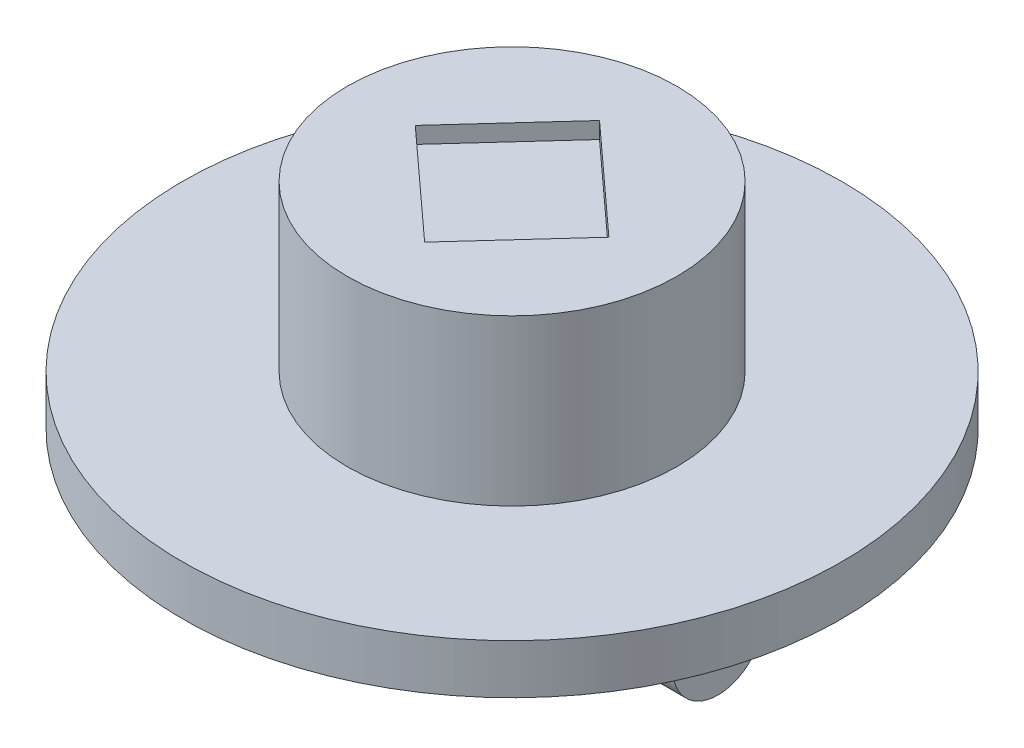
ISO-10303-21;
HEADER;
FILE_DESCRIPTION(('STEP AP214'),'2;1');
FILE_NAME('part.step','',(''),(''),'','','');
FILE_SCHEMA(('AUTOMOTIVE_DESIGN { 1 0 10303 214 1 1 1 1 }'));
ENDSEC;
DATA;
#1=APPLICATION_CONTEXT('core data for automotive mechanical design processes');
#2=APPLICATION_PROTOCOL_DEFINITION('international standard','automotive_design',2000,#1);
#3=PRODUCT_CONTEXT('',#1,'mechanical');
#4=PRODUCT('Part','Part','',(#3));
#5=PRODUCT_RELATED_PRODUCT_CATEGORY('part','',(#4));
#6=PRODUCT_DEFINITION_FORMATION('','',#4);
#7=PRODUCT_DEFINITION_CONTEXT('part definition',#1,'design');
#8=PRODUCT_DEFINITION('design','',#6,#7);
#9=PRODUCT_DEFINITION_SHAPE('','',#8);
#10=(LENGTH_UNIT() NAMED_UNIT(*) SI_UNIT(.MILLI.,.METRE.));
#11=(NAMED_UNIT(*) PLANE_ANGLE_UNIT() SI_UNIT($,.RADIAN.));
#12=(NAMED_UNIT(*) SI_UNIT($,.STERADIAN.) SOLID_ANGLE_UNIT());
#13=UNCERTAINTY_MEASURE_WITH_UNIT(LENGTH_MEASURE(1.E-05),#10,'distance_accuracy_value','');
#14=(GEOMETRIC_REPRESENTATION_CONTEXT(3) GLOBAL_UNCERTAINTY_ASSIGNED_CONTEXT((#13)) GLOBAL_UNIT_ASSIGNED_CONTEXT((#10,
#11,#12)) REPRESENTATION_CONTEXT('',''));
#15=CARTESIAN_POINT('',(0.,0.,0.));
#16=DIRECTION('',(0.,0.,1.));
#17=DIRECTION('',(1.,0.,0.));
#18=AXIS2_PLACEMENT_3D('',#15,#16,#17);
#19=CARTESIAN_POINT('',(0.,7.62,0.));
#20=DIRECTION('',(0.,1.,0.));
#21=DIRECTION('',(0.,0.,1.));
#22=AXIS2_PLACEMENT_3D('',#19,#20,#21);
#23=PLANE('',#22);
#24=CARTESIAN_POINT('',(0.,7.62,0.));
#25=DIRECTION('',(0.,1.,0.));
#26=DIRECTION('',(0.,0.,1.));
#27=AXIS2_PLACEMENT_3D('',#24,#25,#26);
#28=CIRCLE('',#27,50.8);
#29=CARTESIAN_POINT('',(0.,7.62,-50.8));
#30=VERTEX_POINT('',#29);
#31=EDGE_CURVE('E11',#30,#30,#28,.T.);
#32=ORIENTED_EDGE('',*,*,#31,.T.);
#33=EDGE_LOOP('',(#32));
#34=FACE_BOUND('',#33,.T.);
#35=CARTESIAN_POINT('',(0.,7.62,0.));
#36=DIRECTION('',(0.,1.,0.));
#37=DIRECTION('',(0.,0.,1.));
#38=AXIS2_PLACEMENT_3D('',#35,#36,#37);
#39=CIRCLE('',#38,25.4);
#40=CARTESIAN_POINT('',(0.,7.62,25.4));
#41=VERTEX_POINT('',#40);
#42=EDGE_CURVE('E157',#41,#41,#39,.T.);
#43=ORIENTED_EDGE('',*,*,#42,.F.);
#44=EDGE_LOOP('',(#43));
#45=FACE_BOUND('',#44,.T.);
#46=ADVANCED_FACE('F33',(#34,#45),#23,.T.);
#47=CARTESIAN_POINT('',(0.,0.,0.));
#48=DIRECTION('',(0.,1.,0.));
#49=DIRECTION('',(0.,0.,1.));
#50=AXIS2_PLACEMENT_3D('',#47,#48,#49);
#51=PLANE('',#50);
#52=DIRECTION('',(0.,0.,1.));
#53=VECTOR('',#52,1.);
#54=CARTESIAN_POINT('',(-26.67,0.,-6.985));
#55=LINE('',#54,#53);
#56=CARTESIAN_POINT('',(-26.67,0.,-6.985));
#57=VERTEX_POINT('',#56);
#58=CARTESIAN_POINT('',(-26.67,0.,6.985));
#59=VERTEX_POINT('',#58);
#60=EDGE_CURVE('E215',#57,#59,#55,.T.);
#61=ORIENTED_EDGE('',*,*,#60,.F.);
#62=DIRECTION('',(1.,0.,0.));
#63=VECTOR('',#62,1.);
#64=CARTESIAN_POINT('',(-31.75,0.,-6.985));
#65=LINE('',#64,#63);
#66=CARTESIAN_POINT('',(-31.75,0.,-6.985));
#67=VERTEX_POINT('',#66);
#68=EDGE_CURVE('E222',#67,#57,#65,.T.);
#69=ORIENTED_EDGE('',*,*,#68,.F.);
#70=DIRECTION('',(0.,0.,-1.));
#71=VECTOR('',#70,1.);
#72=CARTESIAN_POINT('',(-31.75,0.,-6.985));
#73=LINE('',#72,#71);
#74=CARTESIAN_POINT('',(-31.75,0.,6.985));
#75=VERTEX_POINT('',#74);
#76=EDGE_CURVE('E231',#75,#67,#73,.T.);
#77=ORIENTED_EDGE('',*,*,#76,.F.);
#78=DIRECTION('',(-1.,0.,0.));
#79=VECTOR('',#78,1.);
#80=CARTESIAN_POINT('',(-31.75,0.,6.985));
#81=LINE('',#80,#79);
#82=EDGE_CURVE('E228',#59,#75,#81,.T.);
#83=ORIENTED_EDGE('',*,*,#82,.F.);
#84=EDGE_LOOP('',(#61,#69,#77,#83));
#85=FACE_BOUND('',#84,.T.);
#86=CARTESIAN_POINT('',(0.,0.,0.));
#87=DIRECTION('',(0.,1.,0.));
#88=DIRECTION('',(0.,0.,1.));
#89=AXIS2_PLACEMENT_3D('',#86,#87,#88);
#90=CIRCLE('',#89,50.8);
#91=CARTESIAN_POINT('',(0.,0.,-50.8));
#92=VERTEX_POINT('',#91);
#93=EDGE_CURVE('E37',#92,#92,#90,.T.);
#94=ORIENTED_EDGE('',*,*,#93,.F.);
#95=EDGE_LOOP('',(#94));
#96=FACE_BOUND('',#95,.T.);
#97=DIRECTION('',(0.,0.,1.));
#98=VECTOR('',#97,1.);
#99=CARTESIAN_POINT('',(31.75,0.,-6.985));
#100=LINE('',#99,#98);
#101=CARTESIAN_POINT('',(31.75,0.,-6.985));
#102=VERTEX_POINT('',#101);
#103=CARTESIAN_POINT('',(31.75,0.,6.985));
#104=VERTEX_POINT('',#103);
#105=EDGE_CURVE('E176',#102,#104,#100,.T.);
#106=ORIENTED_EDGE('',*,*,#105,.F.);
#107=DIRECTION('',(1.,0.,0.));
#108=VECTOR('',#107,1.);
#109=CARTESIAN_POINT('',(26.67,0.,-6.985));
#110=LINE('',#109,#108);
#111=CARTESIAN_POINT('',(26.67,0.,-6.985));
#112=VERTEX_POINT('',#111);
#113=EDGE_CURVE('E183',#112,#102,#110,.T.);
#114=ORIENTED_EDGE('',*,*,#113,.F.);
#115=DIRECTION('',(0.,0.,-1.));
#116=VECTOR('',#115,1.);
#117=CARTESIAN_POINT('',(26.67,0.,-6.985));
#118=LINE('',#117,#116);
#119=CARTESIAN_POINT('',(26.67,0.,6.985));
#120=VERTEX_POINT('',#119);
#121=EDGE_CURVE('E190',#120,#112,#118,.T.);
#122=ORIENTED_EDGE('',*,*,#121,.F.);
#123=DIRECTION('',(-1.,0.,0.));
#124=VECTOR('',#123,1.);
#125=CARTESIAN_POINT('',(26.67,0.,6.985));
#126=LINE('',#125,#124);
#127=EDGE_CURVE('E56',#104,#120,#126,.T.);
#128=ORIENTED_EDGE('',*,*,#127,.F.);
#129=EDGE_LOOP('',(#106,#114,#122,#128));
#130=FACE_BOUND('',#129,.T.);
#131=ADVANCED_FACE('F252',(#85,#96,#130),#51,.F.);
#132=CARTESIAN_POINT('',(0.,7.62,0.));
#133=DIRECTION('',(0.,-1.,0.));
#134=DIRECTION('',(0.,0.,-1.));
#135=AXIS2_PLACEMENT_3D('',#132,#133,#134);
#136=CYLINDRICAL_SURFACE('',#135,50.8);
#137=CARTESIAN_POINT('',(0.,7.62,-50.8));
#138=CARTESIAN_POINT('',(0.,7.540625,-50.8));
#139=CARTESIAN_POINT('',(0.,7.46125,-50.8));
#140=CARTESIAN_POINT('',(0.,7.3025,-50.8));
#141=CARTESIAN_POINT('',(0.,7.223125,-50.8));
#142=CARTESIAN_POINT('',(0.,7.064375,-50.8));
#143=CARTESIAN_POINT('',(0.,6.985,-50.8));
#144=CARTESIAN_POINT('',(0.,6.82625,-50.8));
#145=CARTESIAN_POINT('',(0.,6.746875,-50.8));
#146=CARTESIAN_POINT('',(0.,6.588125,-50.8));
#147=CARTESIAN_POINT('',(0.,6.50875,-50.8));
#148=CARTESIAN_POINT('',(0.,6.35,-50.8));
#149=CARTESIAN_POINT('',(0.,6.270625,-50.8));
#150=CARTESIAN_POINT('',(0.,6.111875,-50.8));
#151=CARTESIAN_POINT('',(0.,6.0325,-50.8));
#152=CARTESIAN_POINT('',(0.,5.87375,-50.8));
#153=CARTESIAN_POINT('',(0.,5.794375,-50.8));
#154=CARTESIAN_POINT('',(0.,5.635625,-50.8));
#155=CARTESIAN_POINT('',(0.,5.55625,-50.8));
#156=CARTESIAN_POINT('',(0.,5.3975,-50.8));
#157=CARTESIAN_POINT('',(0.,5.318125,-50.8));
#158=CARTESIAN_POINT('',(0.,5.159375,-50.8));
#159=CARTESIAN_POINT('',(0.,5.08,-50.8));
#160=CARTESIAN_POINT('',(0.,4.92125,-50.8));
#161=CARTESIAN_POINT('',(0.,4.841875,-50.8));
#162=CARTESIAN_POINT('',(0.,4.683125,-50.8));
#163=CARTESIAN_POINT('',(0.,4.60375,-50.8));
#164=CARTESIAN_POINT('',(0.,4.445,-50.8));
#165=CARTESIAN_POINT('',(0.,4.365625,-50.8));
#166=CARTESIAN_POINT('',(0.,4.206875,-50.8));
#167=CARTESIAN_POINT('',(0.,4.1275,-50.8));
#168=CARTESIAN_POINT('',(0.,3.96875,-50.8));
#169=CARTESIAN_POINT('',(0.,3.889375,-50.8));
#170=CARTESIAN_POINT('',(0.,3.730625,-50.8));
#171=CARTESIAN_POINT('',(0.,3.65125,-50.8));
#172=CARTESIAN_POINT('',(0.,3.4925,-50.8));
#173=CARTESIAN_POINT('',(0.,3.413125,-50.8));
#174=CARTESIAN_POINT('',(0.,3.254375,-50.8));
#175=CARTESIAN_POINT('',(0.,3.175,-50.8));
#176=CARTESIAN_POINT('',(0.,3.01625,-50.8));
#177=CARTESIAN_POINT('',(0.,2.936875,-50.8));
#178=CARTESIAN_POINT('',(0.,2.778125,-50.8));
#179=CARTESIAN_POINT('',(0.,2.69875,-50.8));
#180=CARTESIAN_POINT('',(0.,2.54,-50.8));
#181=CARTESIAN_POINT('',(0.,2.460625,-50.8));
#182=CARTESIAN_POINT('',(0.,2.301875,-50.8));
#183=CARTESIAN_POINT('',(0.,2.2225,-50.8));
#184=CARTESIAN_POINT('',(0.,2.06375,-50.8));
#185=CARTESIAN_POINT('',(0.,1.984375,-50.8));
#186=CARTESIAN_POINT('',(0.,1.825625,-50.8));
#187=CARTESIAN_POINT('',(0.,1.74625,-50.8));
#188=CARTESIAN_POINT('',(0.,1.5875,-50.8));
#189=CARTESIAN_POINT('',(0.,1.508125,-50.8));
#190=CARTESIAN_POINT('',(0.,1.349375,-50.8));
#191=CARTESIAN_POINT('',(0.,1.27,-50.8));
#192=CARTESIAN_POINT('',(0.,1.11125,-50.8));
#193=CARTESIAN_POINT('',(0.,1.031875,-50.8));
#194=CARTESIAN_POINT('',(0.,0.873125,-50.8));
#195=CARTESIAN_POINT('',(0.,0.79375,-50.8));
#196=CARTESIAN_POINT('',(0.,0.635,-50.8));
#197=CARTESIAN_POINT('',(0.,0.555625,-50.8));
#198=CARTESIAN_POINT('',(0.,0.396875,-50.8));
#199=CARTESIAN_POINT('',(0.,0.3175,-50.8));
#200=CARTESIAN_POINT('',(0.,0.15875,-50.8));
#201=CARTESIAN_POINT('',(0.,0.0793749999999999,-50.8));
#202=CARTESIAN_POINT('',(0.,0.,-50.8));
#203=B_SPLINE_CURVE_WITH_KNOTS('',3,(#137,#138,#139,#140,#141,#142,#143,#144,#145,#146,#147,
#148,#149,#150,#151,#152,#153,#154,#155,#156,#157,#158,#159,#160,#161,#162,#163,#164,#165,#166,
#167,#168,#169,#170,#171,#172,#173,#174,#175,#176,#177,#178,#179,#180,#181,#182,#183,#184,#185,
#186,#187,#188,#189,#190,#191,#192,#193,#194,#195,#196,#197,#198,#199,#200,#201,#202),
.UNSPECIFIED.,.F.,.F.,(4,2,2,2,2,2,2,2,2,2,2,2,2,2,2,2,2,2,2,2,2,2,2,2,2,2,2,2,2,2,2,2,4),(0.,
0.238125,0.476249999999999,0.714375,0.952499999999999,1.190625,1.42875,1.666875,1.905,2.143125,
2.38125,2.619375,2.8575,3.095625,3.33375,3.571875,3.81,4.048125,4.28625,4.524375,4.7625,
5.000625,5.23875,5.476875,5.715,5.953125,6.19125,6.429375,6.6675,6.905625,7.14375,7.381875,
7.62),.UNSPECIFIED.);
#204=EDGE_CURVE('BSEAM35',#30,#92,#203,.T.);
#205=ORIENTED_EDGE('',*,*,#31,.F.);
#206=ORIENTED_EDGE('',*,*,#93,.T.);
#207=ORIENTED_EDGE('',*,*,#204,.T.);
#208=ORIENTED_EDGE('',*,*,#204,.F.);
#209=EDGE_LOOP('',(#205,#207,#206,#208));
#210=FACE_BOUND('',#209,.T.);
#211=ADVANCED_FACE('F35',(#210),#136,.T.);
#212=CARTESIAN_POINT('',(-26.67,-12.7,-6.985));
#213=DIRECTION('',(-1.,0.,0.));
#214=DIRECTION('',(0.,0.,1.));
#215=AXIS2_PLACEMENT_3D('',#212,#213,#214);
#216=PLANE('',#215);
#217=CARTESIAN_POINT('',(-26.67,-12.7,0.));
#218=DIRECTION('',(-1.,0.,0.));
#219=DIRECTION('',(0.,0.,1.));
#220=AXIS2_PLACEMENT_3D('',#217,#218,#219);
#221=CIRCLE('',#220,2.516115174956);
#222=CARTESIAN_POINT('',(-26.67,-12.7,2.516115174956));
#223=VERTEX_POINT('',#222);
#224=EDGE_CURVE('E206',#223,#223,#221,.T.);
#225=ORIENTED_EDGE('',*,*,#224,.T.);
#226=EDGE_LOOP('',(#225));
#227=FACE_BOUND('',#226,.T.);
#228=DIRECTION('',(0.,1.,0.));
#229=VECTOR('',#228,1.);
#230=CARTESIAN_POINT('',(-26.67,-12.7,6.985));
#231=LINE('',#230,#229);
#232=CARTESIAN_POINT('',(-26.67,-12.7,6.985));
#233=VERTEX_POINT('',#232);
#234=EDGE_CURVE('E244',#233,#59,#231,.T.);
#235=ORIENTED_EDGE('',*,*,#234,.F.);
#236=CARTESIAN_POINT('',(-26.67,-12.7,0.));
#237=DIRECTION('',(-1.,0.,0.));
#238=DIRECTION('',(0.,0.,1.));
#239=AXIS2_PLACEMENT_3D('',#236,#237,#238);
#240=CIRCLE('',#239,6.985);
#241=CARTESIAN_POINT('',(-26.67,-12.7,-6.985));
#242=VERTEX_POINT('',#241);
#243=EDGE_CURVE('E212',#242,#233,#240,.T.);
#244=ORIENTED_EDGE('',*,*,#243,.F.);
#245=DIRECTION('',(0.,1.,0.));
#246=VECTOR('',#245,1.);
#247=CARTESIAN_POINT('',(-26.67,-12.7,-6.985));
#248=LINE('',#247,#246);
#249=EDGE_CURVE('E225',#242,#57,#248,.T.);
#250=ORIENTED_EDGE('',*,*,#249,.T.);
#251=ORIENTED_EDGE('',*,*,#60,.T.);
#252=EDGE_LOOP('',(#235,#244,#250,#251));
#253=FACE_BOUND('',#252,.T.);
#254=ADVANCED_FACE('F287',(#227,#253),#216,.F.);
#255=CARTESIAN_POINT('',(-31.75,-12.7,6.985));
#256=DIRECTION('',(0.,0.,-1.));
#257=DIRECTION('',(-1.,0.,0.));
#258=AXIS2_PLACEMENT_3D('',#255,#256,#257);
#259=PLANE('',#258);
#260=ORIENTED_EDGE('',*,*,#82,.T.);
#261=DIRECTION('',(0.,1.,0.));
#262=VECTOR('',#261,1.);
#263=CARTESIAN_POINT('',(-31.75,-12.7,6.985));
#264=LINE('',#263,#262);
#265=CARTESIAN_POINT('',(-31.75,-12.7,6.985));
#266=VERTEX_POINT('',#265);
#267=EDGE_CURVE('E241',#266,#75,#264,.T.);
#268=ORIENTED_EDGE('',*,*,#267,.F.);
#269=DIRECTION('',(-1.,0.,0.));
#270=VECTOR('',#269,1.);
#271=CARTESIAN_POINT('',(-31.75,-12.7,6.985));
#272=LINE('',#271,#270);
#273=EDGE_CURVE('E218',#233,#266,#272,.T.);
#274=ORIENTED_EDGE('',*,*,#273,.F.);
#275=ORIENTED_EDGE('',*,*,#234,.T.);
#276=EDGE_LOOP('',(#260,#268,#274,#275));
#277=FACE_BOUND('',#276,.T.);
#278=ADVANCED_FACE('F290',(#277),#259,.F.);
#279=CARTESIAN_POINT('',(-31.75,-12.7,-6.985));
#280=DIRECTION('',(1.,0.,0.));
#281=DIRECTION('',(0.,0.,-1.));
#282=AXIS2_PLACEMENT_3D('',#279,#280,#281);
#283=PLANE('',#282);
#284=CARTESIAN_POINT('',(-31.75,-12.7,0.));
#285=DIRECTION('',(-1.,0.,0.));
#286=DIRECTION('',(0.,0.,1.));
#287=AXIS2_PLACEMENT_3D('',#284,#285,#286);
#288=CIRCLE('',#287,2.516115174956);
#289=CARTESIAN_POINT('',(-31.75,-12.7,2.516115174956));
#290=VERTEX_POINT('',#289);
#291=EDGE_CURVE('E205',#290,#290,#288,.T.);
#292=ORIENTED_EDGE('',*,*,#291,.F.);
#293=EDGE_LOOP('',(#292));
#294=FACE_BOUND('',#293,.T.);
#295=DIRECTION('',(0.,1.,0.));
#296=VECTOR('',#295,1.);
#297=CARTESIAN_POINT('',(-31.75,-12.7,-6.985));
#298=LINE('',#297,#296);
#299=CARTESIAN_POINT('',(-31.75,-12.7,-6.985));
#300=VERTEX_POINT('',#299);
#301=EDGE_CURVE('E238',#300,#67,#298,.T.);
#302=ORIENTED_EDGE('',*,*,#301,.F.);
#303=CARTESIAN_POINT('',(-31.75,-12.7,0.));
#304=DIRECTION('',(-1.,0.,0.));
#305=DIRECTION('',(0.,0.,1.));
#306=AXIS2_PLACEMENT_3D('',#303,#304,#305);
#307=CIRCLE('',#306,6.985);
#308=EDGE_CURVE('E209',#300,#266,#307,.T.);
#309=ORIENTED_EDGE('',*,*,#308,.T.);
#310=ORIENTED_EDGE('',*,*,#267,.T.);
#311=ORIENTED_EDGE('',*,*,#76,.T.);
#312=EDGE_LOOP('',(#302,#309,#310,#311));
#313=FACE_BOUND('',#312,.T.);
#314=ADVANCED_FACE('F294',(#294,#313),#283,.F.);
#315=CARTESIAN_POINT('',(-31.75,-12.7,-6.985));
#316=DIRECTION('',(0.,0.,1.));
#317=DIRECTION('',(1.,0.,0.));
#318=AXIS2_PLACEMENT_3D('',#315,#316,#317);
#319=PLANE('',#318);
#320=ORIENTED_EDGE('',*,*,#68,.T.);
#321=ORIENTED_EDGE('',*,*,#249,.F.);
#322=DIRECTION('',(1.,0.,0.));
#323=VECTOR('',#322,1.);
#324=CARTESIAN_POINT('',(-31.75,-12.7,-6.985));
#325=LINE('',#324,#323);
#326=EDGE_CURVE('E221',#300,#242,#325,.T.);
#327=ORIENTED_EDGE('',*,*,#326,.F.);
#328=ORIENTED_EDGE('',*,*,#301,.T.);
#329=EDGE_LOOP('',(#320,#321,#327,#328));
#330=FACE_BOUND('',#329,.T.);
#331=ADVANCED_FACE('F297',(#330),#319,.F.);
#332=CARTESIAN_POINT('',(-26.67,-12.7,0.));
#333=DIRECTION('',(-1.,0.,0.));
#334=DIRECTION('',(0.,0.,1.));
#335=AXIS2_PLACEMENT_3D('',#332,#333,#334);
#336=CYLINDRICAL_SURFACE('',#335,6.985);
#337=ORIENTED_EDGE('',*,*,#326,.T.);
#338=ORIENTED_EDGE('',*,*,#243,.T.);
#339=ORIENTED_EDGE('',*,*,#273,.T.);
#340=ORIENTED_EDGE('',*,*,#308,.F.);
#341=EDGE_LOOP('',(#337,#338,#339,#340));
#342=FACE_BOUND('',#341,.T.);
#343=ADVANCED_FACE('F301',(#342),#336,.T.);
#344=CARTESIAN_POINT('',(-26.67,-12.7,0.));
#345=DIRECTION('',(-1.,0.,0.));
#346=DIRECTION('',(0.,0.,1.));
#347=AXIS2_PLACEMENT_3D('',#344,#345,#346);
#348=CYLINDRICAL_SURFACE('',#347,2.516115174956);
#349=ORIENTED_EDGE('',*,*,#224,.F.);
#350=EDGE_LOOP('',(#349));
#351=FACE_BOUND('',#350,.T.);
#352=ORIENTED_EDGE('',*,*,#291,.T.);
#353=EDGE_LOOP('',(#352));
#354=FACE_BOUND('',#353,.T.);
#355=ADVANCED_FACE('F277',(#351,#354),#348,.F.);
#356=CARTESIAN_POINT('',(31.75,-12.7,-6.985));
#357=DIRECTION('',(-1.,0.,0.));
#358=DIRECTION('',(0.,0.,1.));
#359=AXIS2_PLACEMENT_3D('',#356,#357,#358);
#360=PLANE('',#359);
#361=CARTESIAN_POINT('',(31.75,-12.7,0.));
#362=DIRECTION('',(1.,0.,0.));
#363=DIRECTION('',(0.,0.,-1.));
#364=AXIS2_PLACEMENT_3D('',#361,#362,#363);
#365=CIRCLE('',#364,2.54);
#366=CARTESIAN_POINT('',(31.75,-12.7,-2.54));
#367=VERTEX_POINT('',#366);
#368=EDGE_CURVE('E164',#367,#367,#365,.T.);
#369=ORIENTED_EDGE('',*,*,#368,.F.);
#370=EDGE_LOOP('',(#369));
#371=FACE_BOUND('',#370,.T.);
#372=DIRECTION('',(0.,1.,0.));
#373=VECTOR('',#372,1.);
#374=CARTESIAN_POINT('',(31.75,-12.7,6.985));
#375=LINE('',#374,#373);
#376=CARTESIAN_POINT('',(31.75,-12.7,6.985));
#377=VERTEX_POINT('',#376);
#378=EDGE_CURVE('E203',#377,#104,#375,.T.);
#379=ORIENTED_EDGE('',*,*,#378,.F.);
#380=CARTESIAN_POINT('',(31.75,-12.7,0.));
#381=DIRECTION('',(1.,0.,0.));
#382=DIRECTION('',(0.,0.,-1.));
#383=AXIS2_PLACEMENT_3D('',#380,#381,#382);
#384=CIRCLE('',#383,6.985);
#385=CARTESIAN_POINT('',(31.75,-12.7,-6.985));
#386=VERTEX_POINT('',#385);
#387=EDGE_CURVE('E170',#377,#386,#384,.T.);
#388=ORIENTED_EDGE('',*,*,#387,.T.);
#389=DIRECTION('',(0.,1.,0.));
#390=VECTOR('',#389,1.);
#391=CARTESIAN_POINT('',(31.75,-12.7,-6.985));
#392=LINE('',#391,#390);
#393=EDGE_CURVE('E186',#386,#102,#392,.T.);
#394=ORIENTED_EDGE('',*,*,#393,.T.);
#395=ORIENTED_EDGE('',*,*,#105,.T.);
#396=EDGE_LOOP('',(#379,#388,#394,#395));
#397=FACE_BOUND('',#396,.T.);
#398=ADVANCED_FACE('F259',(#371,#397),#360,.F.);
#399=CARTESIAN_POINT('',(26.67,-12.7,6.985));
#400=DIRECTION('',(0.,0.,-1.));
#401=DIRECTION('',(-1.,0.,0.));
#402=AXIS2_PLACEMENT_3D('',#399,#400,#401);
#403=PLANE('',#402);
#404=ORIENTED_EDGE('',*,*,#127,.T.);
#405=DIRECTION('',(0.,1.,0.));
#406=VECTOR('',#405,1.);
#407=CARTESIAN_POINT('',(26.67,-12.7,6.985));
#408=LINE('',#407,#406);
#409=CARTESIAN_POINT('',(26.67,-12.7,6.985));
#410=VERTEX_POINT('',#409);
#411=EDGE_CURVE('E200',#410,#120,#408,.T.);
#412=ORIENTED_EDGE('',*,*,#411,.F.);
#413=DIRECTION('',(-1.,0.,0.));
#414=VECTOR('',#413,1.);
#415=CARTESIAN_POINT('',(26.67,-12.7,6.985));
#416=LINE('',#415,#414);
#417=EDGE_CURVE('E179',#377,#410,#416,.T.);
#418=ORIENTED_EDGE('',*,*,#417,.F.);
#419=ORIENTED_EDGE('',*,*,#378,.T.);
#420=EDGE_LOOP('',(#404,#412,#418,#419));
#421=FACE_BOUND('',#420,.T.);
#422=ADVANCED_FACE('F268',(#421),#403,.F.);
#423=CARTESIAN_POINT('',(26.67,-12.7,-6.985));
#424=DIRECTION('',(1.,0.,0.));
#425=DIRECTION('',(0.,0.,-1.));
#426=AXIS2_PLACEMENT_3D('',#423,#424,#425);
#427=PLANE('',#426);
#428=CARTESIAN_POINT('',(26.67,-12.7,0.));
#429=DIRECTION('',(1.,0.,0.));
#430=DIRECTION('',(0.,0.,-1.));
#431=AXIS2_PLACEMENT_3D('',#428,#429,#430);
#432=CIRCLE('',#431,2.54);
#433=CARTESIAN_POINT('',(26.67,-12.7,-2.54));
#434=VERTEX_POINT('',#433);
#435=EDGE_CURVE('E167',#434,#434,#432,.T.);
#436=ORIENTED_EDGE('',*,*,#435,.T.);
#437=EDGE_LOOP('',(#436));
#438=FACE_BOUND('',#437,.T.);
#439=DIRECTION('',(0.,1.,0.));
#440=VECTOR('',#439,1.);
#441=CARTESIAN_POINT('',(26.67,-12.7,-6.985));
#442=LINE('',#441,#440);
#443=CARTESIAN_POINT('',(26.67,-12.7,-6.985));
#444=VERTEX_POINT('',#443);
#445=EDGE_CURVE('E197',#444,#112,#442,.T.);
#446=ORIENTED_EDGE('',*,*,#445,.F.);
#447=CARTESIAN_POINT('',(26.67,-12.7,0.));
#448=DIRECTION('',(1.,0.,0.));
#449=DIRECTION('',(0.,0.,-1.));
#450=AXIS2_PLACEMENT_3D('',#447,#448,#449);
#451=CIRCLE('',#450,6.985);
#452=EDGE_CURVE('E173',#410,#444,#451,.T.);
#453=ORIENTED_EDGE('',*,*,#452,.F.);
#454=ORIENTED_EDGE('',*,*,#411,.T.);
#455=ORIENTED_EDGE('',*,*,#121,.T.);
#456=EDGE_LOOP('',(#446,#453,#454,#455));
#457=FACE_BOUND('',#456,.T.);
#458=ADVANCED_FACE('F266',(#438,#457),#427,.F.);
#459=CARTESIAN_POINT('',(26.67,-12.7,-6.985));
#460=DIRECTION('',(0.,0.,1.));
#461=DIRECTION('',(1.,0.,0.));
#462=AXIS2_PLACEMENT_3D('',#459,#460,#461);
#463=PLANE('',#462);
#464=ORIENTED_EDGE('',*,*,#113,.T.);
#465=ORIENTED_EDGE('',*,*,#393,.F.);
#466=DIRECTION('',(1.,0.,0.));
#467=VECTOR('',#466,1.);
#468=CARTESIAN_POINT('',(26.67,-12.7,-6.985));
#469=LINE('',#468,#467);
#470=EDGE_CURVE('E182',#444,#386,#469,.T.);
#471=ORIENTED_EDGE('',*,*,#470,.F.);
#472=ORIENTED_EDGE('',*,*,#445,.T.);
#473=EDGE_LOOP('',(#464,#465,#471,#472));
#474=FACE_BOUND('',#473,.T.);
#475=ADVANCED_FACE('F257',(#474),#463,.F.);
#476=CARTESIAN_POINT('',(26.67,-12.7,0.));
#477=DIRECTION('',(1.,0.,0.));
#478=DIRECTION('',(0.,0.,-1.));
#479=AXIS2_PLACEMENT_3D('',#476,#477,#478);
#480=CYLINDRICAL_SURFACE('',#479,6.985);
#481=ORIENTED_EDGE('',*,*,#417,.T.);
#482=ORIENTED_EDGE('',*,*,#452,.T.);
#483=ORIENTED_EDGE('',*,*,#470,.T.);
#484=ORIENTED_EDGE('',*,*,#387,.F.);
#485=EDGE_LOOP('',(#481,#482,#483,#484));
#486=FACE_BOUND('',#485,.T.);
#487=ADVANCED_FACE('F263',(#486),#480,.T.);
#488=CARTESIAN_POINT('',(26.67,-12.7,0.));
#489=DIRECTION('',(1.,0.,0.));
#490=DIRECTION('',(0.,0.,-1.));
#491=AXIS2_PLACEMENT_3D('',#488,#489,#490);
#492=CYLINDRICAL_SURFACE('',#491,2.54);
#493=ORIENTED_EDGE('',*,*,#435,.F.);
#494=EDGE_LOOP('',(#493));
#495=FACE_BOUND('',#494,.T.);
#496=ORIENTED_EDGE('',*,*,#368,.T.);
#497=EDGE_LOOP('',(#496));
#498=FACE_BOUND('',#497,.T.);
#499=ADVANCED_FACE('F346',(#495,#498),#492,.F.);
#500=CARTESIAN_POINT('',(0.,33.02,0.));
#501=DIRECTION('',(0.,-1.,0.));
#502=DIRECTION('',(0.,0.,-1.));
#503=AXIS2_PLACEMENT_3D('',#500,#501,#502);
#504=CYLINDRICAL_SURFACE('',#503,25.4);
#505=CARTESIAN_POINT('',(0.,33.02,0.));
#506=DIRECTION('',(0.,1.,0.));
#507=DIRECTION('',(0.,0.,1.));
#508=AXIS2_PLACEMENT_3D('',#505,#506,#507);
#509=CIRCLE('',#508,25.4);
#510=CARTESIAN_POINT('',(0.,33.02,25.4));
#511=VERTEX_POINT('',#510);
#512=EDGE_CURVE('E161',#511,#511,#509,.T.);
#513=ORIENTED_EDGE('',*,*,#512,.F.);
#514=EDGE_LOOP('',(#513));
#515=FACE_BOUND('',#514,.T.);
#516=ORIENTED_EDGE('',*,*,#42,.T.);
#517=EDGE_LOOP('',(#516));
#518=FACE_BOUND('',#517,.T.);
#519=ADVANCED_FACE('F350',(#515,#518),#504,.T.);
#520=CARTESIAN_POINT('',(0.,33.02,0.));
#521=DIRECTION('',(0.,1.,0.));
#522=DIRECTION('',(0.,0.,1.));
#523=AXIS2_PLACEMENT_3D('',#520,#521,#522);
#524=PLANE('',#523);
#525=DIRECTION('',(0.673649473387308,0.,-0.739051004332585));
#526=VECTOR('',#525,1.);
#527=CARTESIAN_POINT('',(1.37873117016431,33.02,14.8586710916696));
#528=LINE('',#527,#526);
#529=CARTESIAN_POINT('',(1.37873117016431,33.02,14.8586710916696));
#530=VERTEX_POINT('',#529);
#531=CARTESIAN_POINT('',(14.9225,33.02,0.));
#532=VERTEX_POINT('',#531);
#533=EDGE_CURVE('E48',#530,#532,#528,.T.);
#534=ORIENTED_EDGE('',*,*,#533,.F.);
#535=DIRECTION('',(0.739051004332585,0.,0.673649473387308));
#536=VECTOR('',#535,1.);
#537=CARTESIAN_POINT('',(1.37873117016431,33.02,14.8586710916696));
#538=LINE('',#537,#536);
#539=CARTESIAN_POINT('',(-14.9225,33.02,0.));
#540=VERTEX_POINT('',#539);
#541=EDGE_CURVE('E142',#540,#530,#538,.T.);
#542=ORIENTED_EDGE('',*,*,#541,.F.);
#543=DIRECTION('',(-0.673649473387308,0.,0.739051004332585));
#544=VECTOR('',#543,1.);
#545=CARTESIAN_POINT('',(-14.9225,33.02,0.));
#546=LINE('',#545,#544);
#547=CARTESIAN_POINT('',(-1.37873117016431,33.02,-14.8586710916696));
#548=VERTEX_POINT('',#547);
#549=EDGE_CURVE('E145',#548,#540,#546,.T.);
#550=ORIENTED_EDGE('',*,*,#549,.F.);
#551=DIRECTION('',(-0.739051004332585,0.,-0.673649473387308));
#552=VECTOR('',#551,1.);
#553=CARTESIAN_POINT('',(14.9225,33.02,0.));
#554=LINE('',#553,#552);
#555=EDGE_CURVE('E151',#532,#548,#554,.T.);
#556=ORIENTED_EDGE('',*,*,#555,.F.);
#557=EDGE_LOOP('',(#534,#542,#550,#556));
#558=FACE_BOUND('',#557,.T.);
#559=ORIENTED_EDGE('',*,*,#512,.T.);
#560=EDGE_LOOP('',(#559));
#561=FACE_BOUND('',#560,.T.);
#562=ADVANCED_FACE('F365',(#558,#561),#524,.T.);
#563=CARTESIAN_POINT('',(1.37873117016431,30.48,14.8586710916696));
#564=DIRECTION('',(0.739051004332585,0.,0.673649473387308));
#565=DIRECTION('',(0.673649473387308,0.,-0.739051004332585));
#566=AXIS2_PLACEMENT_3D('',#563,#564,#565);
#567=PLANE('',#566);
#568=ORIENTED_EDGE('',*,*,#533,.T.);
#569=DIRECTION('',(0.,1.,0.));
#570=VECTOR('',#569,1.);
#571=CARTESIAN_POINT('',(14.9225,30.48,0.));
#572=LINE('',#571,#570);
#573=CARTESIAN_POINT('',(14.9225,30.48,0.));
#574=VERTEX_POINT('',#573);
#575=EDGE_CURVE('E120',#574,#532,#572,.T.);
#576=ORIENTED_EDGE('',*,*,#575,.F.);
#577=DIRECTION('',(0.673649473387308,0.,-0.739051004332585));
#578=VECTOR('',#577,1.);
#579=CARTESIAN_POINT('',(1.37873117016431,30.48,14.8586710916696));
#580=LINE('',#579,#578);
#581=CARTESIAN_POINT('',(1.37873117016431,30.48,14.8586710916696));
#582=VERTEX_POINT('',#581);
#583=EDGE_CURVE('E124',#582,#574,#580,.T.);
#584=ORIENTED_EDGE('',*,*,#583,.F.);
#585=DIRECTION('',(0.,1.,0.));
#586=VECTOR('',#585,1.);
#587=CARTESIAN_POINT('',(1.37873117016431,30.48,14.8586710916696));
#588=LINE('',#587,#586);
#589=EDGE_CURVE('E155',#582,#530,#588,.T.);
#590=ORIENTED_EDGE('',*,*,#589,.T.);
#591=EDGE_LOOP('',(#568,#576,#584,#590));
#592=FACE_BOUND('',#591,.T.);
#593=ADVANCED_FACE('F122',(#592),#567,.F.);
#594=CARTESIAN_POINT('',(1.37873117016431,30.48,14.8586710916696));
#595=DIRECTION('',(-0.673649473387308,0.,0.739051004332585));
#596=DIRECTION('',(0.739051004332585,0.,0.673649473387308));
#597=AXIS2_PLACEMENT_3D('',#594,#595,#596);
#598=PLANE('',#597);
#599=ORIENTED_EDGE('',*,*,#541,.T.);
#600=ORIENTED_EDGE('',*,*,#589,.F.);
#601=DIRECTION('',(0.739051004332585,0.,0.673649473387308));
#602=VECTOR('',#601,1.);
#603=CARTESIAN_POINT('',(1.37873117016431,30.48,14.8586710916696));
#604=LINE('',#603,#602);
#605=CARTESIAN_POINT('',(-14.9225,30.48,0.));
#606=VERTEX_POINT('',#605);
#607=EDGE_CURVE('E130',#606,#582,#604,.T.);
#608=ORIENTED_EDGE('',*,*,#607,.F.);
#609=DIRECTION('',(0.,1.,0.));
#610=VECTOR('',#609,1.);
#611=CARTESIAN_POINT('',(-14.9225,30.48,0.));
#612=LINE('',#611,#610);
#613=EDGE_CURVE('E158',#606,#540,#612,.T.);
#614=ORIENTED_EDGE('',*,*,#613,.T.);
#615=EDGE_LOOP('',(#599,#600,#608,#614));
#616=FACE_BOUND('',#615,.T.);
#617=ADVANCED_FACE('F384',(#616),#598,.F.);
#618=CARTESIAN_POINT('',(-14.9225,30.48,0.));
#619=DIRECTION('',(-0.739051004332585,0.,-0.673649473387308));
#620=DIRECTION('',(-0.673649473387308,0.,0.739051004332585));
#621=AXIS2_PLACEMENT_3D('',#618,#619,#620);
#622=PLANE('',#621);
#623=ORIENTED_EDGE('',*,*,#549,.T.);
#624=ORIENTED_EDGE('',*,*,#613,.F.);
#625=DIRECTION('',(-0.673649473387308,0.,0.739051004332585));
#626=VECTOR('',#625,1.);
#627=CARTESIAN_POINT('',(-14.9225,30.48,0.));
#628=LINE('',#627,#626);
#629=CARTESIAN_POINT('',(-1.37873117016431,30.48,-14.8586710916696));
#630=VERTEX_POINT('',#629);
#631=EDGE_CURVE('E138',#630,#606,#628,.T.);
#632=ORIENTED_EDGE('',*,*,#631,.F.);
#633=DIRECTION('',(0.,1.,0.));
#634=VECTOR('',#633,1.);
#635=CARTESIAN_POINT('',(-1.37873117016431,30.48,-14.8586710916696));
#636=LINE('',#635,#634);
#637=EDGE_CURVE('E129',#630,#548,#636,.T.);
#638=ORIENTED_EDGE('',*,*,#637,.T.);
#639=EDGE_LOOP('',(#623,#624,#632,#638));
#640=FACE_BOUND('',#639,.T.);
#641=ADVANCED_FACE('F393',(#640),#622,.F.);
#642=CARTESIAN_POINT('',(14.9225,30.48,0.));
#643=DIRECTION('',(0.673649473387308,0.,-0.739051004332585));
#644=DIRECTION('',(-0.739051004332585,0.,-0.673649473387308));
#645=AXIS2_PLACEMENT_3D('',#642,#643,#644);
#646=PLANE('',#645);
#647=ORIENTED_EDGE('',*,*,#555,.T.);
#648=ORIENTED_EDGE('',*,*,#637,.F.);
#649=DIRECTION('',(-0.739051004332585,0.,-0.673649473387308));
#650=VECTOR('',#649,1.);
#651=CARTESIAN_POINT('',(14.9225,30.48,0.));
#652=LINE('',#651,#650);
#653=EDGE_CURVE('E133',#574,#630,#652,.T.);
#654=ORIENTED_EDGE('',*,*,#653,.F.);
#655=ORIENTED_EDGE('',*,*,#575,.T.);
#656=EDGE_LOOP('',(#647,#648,#654,#655));
#657=FACE_BOUND('',#656,.T.);
#658=ADVANCED_FACE('F134',(#657),#646,.F.);
#659=CARTESIAN_POINT('',(0.,30.48,0.));
#660=DIRECTION('',(0.,1.,0.));
#661=DIRECTION('',(0.,0.,1.));
#662=AXIS2_PLACEMENT_3D('',#659,#660,#661);
#663=PLANE('',#662);
#664=ORIENTED_EDGE('',*,*,#583,.T.);
#665=ORIENTED_EDGE('',*,*,#653,.T.);
#666=ORIENTED_EDGE('',*,*,#631,.T.);
#667=ORIENTED_EDGE('',*,*,#607,.T.);
#668=EDGE_LOOP('',(#664,#665,#666,#667));
#669=FACE_BOUND('',#668,.T.);
#670=ADVANCED_FACE('F140',(#669),#663,.T.);
#671=CLOSED_SHELL('',(#46,#131,#211,#254,#278,#314,#331,#343,#355,#398,#422,#458,#475,#487,#499,
#519,#562,#593,#617,#641,#658,#670));
#672=MANIFOLD_SOLID_BREP('B2',#671);
#673=ADVANCED_BREP_SHAPE_REPRESENTATION('',(#18,#672),#14);
#674=SHAPE_DEFINITION_REPRESENTATION(#9,#673);
ENDSEC;
END-ISO-10303-21;
